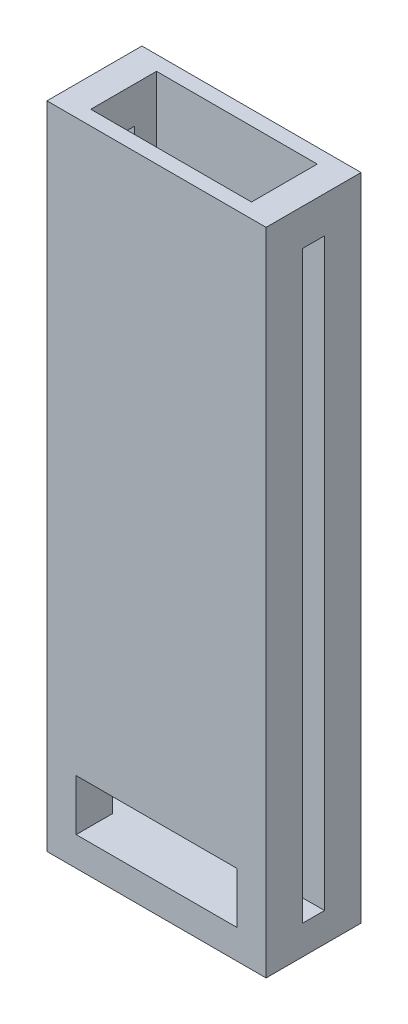
ISO-10303-21;
HEADER;
FILE_DESCRIPTION(('STEP AP214'),'2;1');
FILE_NAME('part.step','',(''),(''),'','','');
FILE_SCHEMA(('AUTOMOTIVE_DESIGN { 1 0 10303 214 1 1 1 1 }'));
ENDSEC;
DATA;
#1=APPLICATION_CONTEXT('core data for automotive mechanical design processes');
#2=APPLICATION_PROTOCOL_DEFINITION('international standard','automotive_design',2000,#1);
#3=PRODUCT_CONTEXT('',#1,'mechanical');
#4=PRODUCT('Part','Part','',(#3));
#5=PRODUCT_RELATED_PRODUCT_CATEGORY('part','',(#4));
#6=PRODUCT_DEFINITION_FORMATION('','',#4);
#7=PRODUCT_DEFINITION_CONTEXT('part definition',#1,'design');
#8=PRODUCT_DEFINITION('design','',#6,#7);
#9=PRODUCT_DEFINITION_SHAPE('','',#8);
#10=(LENGTH_UNIT() NAMED_UNIT(*) SI_UNIT(.MILLI.,.METRE.));
#11=(NAMED_UNIT(*) PLANE_ANGLE_UNIT() SI_UNIT($,.RADIAN.));
#12=(NAMED_UNIT(*) SI_UNIT($,.STERADIAN.) SOLID_ANGLE_UNIT());
#13=UNCERTAINTY_MEASURE_WITH_UNIT(LENGTH_MEASURE(1.E-05),#10,'distance_accuracy_value','');
#14=(GEOMETRIC_REPRESENTATION_CONTEXT(3) GLOBAL_UNCERTAINTY_ASSIGNED_CONTEXT((#13)) GLOBAL_UNIT_ASSIGNED_CONTEXT((#10,
#11,#12)) REPRESENTATION_CONTEXT('',''));
#15=CARTESIAN_POINT('',(0.,0.,0.));
#16=DIRECTION('',(0.,0.,1.));
#17=DIRECTION('',(1.,0.,0.));
#18=AXIS2_PLACEMENT_3D('',#15,#16,#17);
#19=CARTESIAN_POINT('',(0.,85.,13.));
#20=DIRECTION('',(0.,0.,-1.));
#21=DIRECTION('',(-1.,0.,0.));
#22=AXIS2_PLACEMENT_3D('',#19,#20,#21);
#23=PLANE('',#22);
#24=DIRECTION('',(0.,-1.,0.));
#25=VECTOR('',#24,1.);
#26=CARTESIAN_POINT('',(0.,85.,13.));
#27=LINE('',#26,#25);
#28=CARTESIAN_POINT('',(0.,85.,13.));
#29=VERTEX_POINT('',#28);
#30=CARTESIAN_POINT('',(0.,-4.,13.));
#31=VERTEX_POINT('',#30);
#32=EDGE_CURVE('E370',#29,#31,#27,.T.);
#33=ORIENTED_EDGE('',*,*,#32,.T.);
#34=DIRECTION('',(1.,0.,0.));
#35=VECTOR('',#34,1.);
#36=CARTESIAN_POINT('',(0.,-4.,13.));
#37=LINE('',#36,#35);
#38=CARTESIAN_POINT('',(30.,-4.,13.));
#39=VERTEX_POINT('',#38);
#40=EDGE_CURVE('E298',#31,#39,#37,.T.);
#41=ORIENTED_EDGE('',*,*,#40,.T.);
#42=DIRECTION('',(0.,-1.,0.));
#43=VECTOR('',#42,1.);
#44=CARTESIAN_POINT('',(30.,85.,13.));
#45=LINE('',#44,#43);
#46=CARTESIAN_POINT('',(30.,85.,13.));
#47=VERTEX_POINT('',#46);
#48=EDGE_CURVE('E367',#47,#39,#45,.T.);
#49=ORIENTED_EDGE('',*,*,#48,.F.);
#50=DIRECTION('',(1.,0.,0.));
#51=VECTOR('',#50,1.);
#52=CARTESIAN_POINT('',(0.,85.,13.));
#53=LINE('',#52,#51);
#54=EDGE_CURVE('E352',#29,#47,#53,.T.);
#55=ORIENTED_EDGE('',*,*,#54,.F.);
#56=EDGE_LOOP('',(#33,#41,#49,#55));
#57=FACE_BOUND('',#56,.T.);
#58=DIRECTION('',(0.,1.,0.));
#59=VECTOR('',#58,1.);
#60=CARTESIAN_POINT('',(4.,0.,13.));
#61=LINE('',#60,#59);
#62=CARTESIAN_POINT('',(4.,0.,13.));
#63=VERTEX_POINT('',#62);
#64=CARTESIAN_POINT('',(4.,7.,13.));
#65=VERTEX_POINT('',#64);
#66=EDGE_CURVE('E252',#63,#65,#61,.T.);
#67=ORIENTED_EDGE('',*,*,#66,.T.);
#68=DIRECTION('',(1.,0.,0.));
#69=VECTOR('',#68,1.);
#70=CARTESIAN_POINT('',(4.,7.,13.));
#71=LINE('',#70,#69);
#72=CARTESIAN_POINT('',(26.,7.,13.));
#73=VERTEX_POINT('',#72);
#74=EDGE_CURVE('E272',#65,#73,#71,.T.);
#75=ORIENTED_EDGE('',*,*,#74,.T.);
#76=DIRECTION('',(0.,1.,0.));
#77=VECTOR('',#76,1.);
#78=CARTESIAN_POINT('',(26.,0.,13.));
#79=LINE('',#78,#77);
#80=CARTESIAN_POINT('',(26.,0.,13.));
#81=VERTEX_POINT('',#80);
#82=EDGE_CURVE('E276',#81,#73,#79,.T.);
#83=ORIENTED_EDGE('',*,*,#82,.F.);
#84=DIRECTION('',(1.,0.,0.));
#85=VECTOR('',#84,1.);
#86=CARTESIAN_POINT('',(4.,0.,13.));
#87=LINE('',#86,#85);
#88=EDGE_CURVE('E257',#63,#81,#87,.T.);
#89=ORIENTED_EDGE('',*,*,#88,.F.);
#90=EDGE_LOOP('',(#67,#75,#83,#89));
#91=FACE_BOUND('',#90,.T.);
#92=ADVANCED_FACE('F38',(#57,#91),#23,.F.);
#93=CARTESIAN_POINT('',(0.,85.,0.));
#94=DIRECTION('',(0.,0.,1.));
#95=DIRECTION('',(1.,0.,0.));
#96=AXIS2_PLACEMENT_3D('',#93,#94,#95);
#97=PLANE('',#96);
#98=DIRECTION('',(0.,-1.,0.));
#99=VECTOR('',#98,1.);
#100=CARTESIAN_POINT('',(30.,85.,0.));
#101=LINE('',#100,#99);
#102=CARTESIAN_POINT('',(30.,85.,0.));
#103=VERTEX_POINT('',#102);
#104=CARTESIAN_POINT('',(30.,-4.,0.));
#105=VERTEX_POINT('',#104);
#106=EDGE_CURVE('E364',#103,#105,#101,.T.);
#107=ORIENTED_EDGE('',*,*,#106,.T.);
#108=DIRECTION('',(-1.,0.,0.));
#109=VECTOR('',#108,1.);
#110=CARTESIAN_POINT('',(0.,-4.,0.));
#111=LINE('',#110,#109);
#112=CARTESIAN_POINT('',(0.,-4.,0.));
#113=VERTEX_POINT('',#112);
#114=EDGE_CURVE('E306',#105,#113,#111,.T.);
#115=ORIENTED_EDGE('',*,*,#114,.T.);
#116=DIRECTION('',(0.,-1.,0.));
#117=VECTOR('',#116,1.);
#118=CARTESIAN_POINT('',(0.,85.,0.));
#119=LINE('',#118,#117);
#120=CARTESIAN_POINT('',(0.,85.,0.));
#121=VERTEX_POINT('',#120);
#122=EDGE_CURVE('E361',#121,#113,#119,.T.);
#123=ORIENTED_EDGE('',*,*,#122,.F.);
#124=DIRECTION('',(-1.,0.,0.));
#125=VECTOR('',#124,1.);
#126=CARTESIAN_POINT('',(0.,85.,0.));
#127=LINE('',#126,#125);
#128=EDGE_CURVE('E358',#103,#121,#127,.T.);
#129=ORIENTED_EDGE('',*,*,#128,.F.);
#130=EDGE_LOOP('',(#107,#115,#123,#129));
#131=FACE_BOUND('',#130,.T.);
#132=DIRECTION('',(0.,1.,0.));
#133=VECTOR('',#132,1.);
#134=CARTESIAN_POINT('',(4.,0.,0.));
#135=LINE('',#134,#133);
#136=CARTESIAN_POINT('',(4.,0.,0.));
#137=VERTEX_POINT('',#136);
#138=CARTESIAN_POINT('',(4.,7.,0.));
#139=VERTEX_POINT('',#138);
#140=EDGE_CURVE('E253',#137,#139,#135,.T.);
#141=ORIENTED_EDGE('',*,*,#140,.F.);
#142=DIRECTION('',(1.,0.,0.));
#143=VECTOR('',#142,1.);
#144=CARTESIAN_POINT('',(4.,0.,0.));
#145=LINE('',#144,#143);
#146=CARTESIAN_POINT('',(26.,0.,0.));
#147=VERTEX_POINT('',#146);
#148=EDGE_CURVE('E264',#137,#147,#145,.T.);
#149=ORIENTED_EDGE('',*,*,#148,.T.);
#150=DIRECTION('',(0.,1.,0.));
#151=VECTOR('',#150,1.);
#152=CARTESIAN_POINT('',(26.,0.,0.));
#153=LINE('',#152,#151);
#154=CARTESIAN_POINT('',(26.,7.,0.));
#155=VERTEX_POINT('',#154);
#156=EDGE_CURVE('E260',#147,#155,#153,.T.);
#157=ORIENTED_EDGE('',*,*,#156,.T.);
#158=DIRECTION('',(1.,0.,0.));
#159=VECTOR('',#158,1.);
#160=CARTESIAN_POINT('',(4.,7.,0.));
#161=LINE('',#160,#159);
#162=EDGE_CURVE('E256',#139,#155,#161,.T.);
#163=ORIENTED_EDGE('',*,*,#162,.F.);
#164=EDGE_LOOP('',(#141,#149,#157,#163));
#165=FACE_BOUND('',#164,.T.);
#166=ADVANCED_FACE('F431',(#131,#165),#97,.F.);
#167=CARTESIAN_POINT('',(4.,0.,11.));
#168=DIRECTION('',(0.,0.,1.));
#169=DIRECTION('',(1.,0.,0.));
#170=AXIS2_PLACEMENT_3D('',#167,#168,#169);
#171=PLANE('',#170);
#172=DIRECTION('',(1.,0.,0.));
#173=VECTOR('',#172,1.);
#174=CARTESIAN_POINT('',(4.,7.,11.));
#175=LINE('',#174,#173);
#176=CARTESIAN_POINT('',(4.,7.,11.));
#177=VERTEX_POINT('',#176);
#178=CARTESIAN_POINT('',(26.,7.,11.));
#179=VERTEX_POINT('',#178);
#180=EDGE_CURVE('E291',#177,#179,#175,.T.);
#181=ORIENTED_EDGE('',*,*,#180,.F.);
#182=DIRECTION('',(0.,1.,0.));
#183=VECTOR('',#182,1.);
#184=CARTESIAN_POINT('',(4.,0.,11.));
#185=LINE('',#184,#183);
#186=CARTESIAN_POINT('',(4.,85.,11.));
#187=VERTEX_POINT('',#186);
#188=EDGE_CURVE('E341',#177,#187,#185,.T.);
#189=ORIENTED_EDGE('',*,*,#188,.T.);
#190=DIRECTION('',(1.,0.,0.));
#191=VECTOR('',#190,1.);
#192=CARTESIAN_POINT('',(4.,85.,11.));
#193=LINE('',#192,#191);
#194=CARTESIAN_POINT('',(26.,85.,11.));
#195=VERTEX_POINT('',#194);
#196=EDGE_CURVE('E333',#187,#195,#193,.T.);
#197=ORIENTED_EDGE('',*,*,#196,.T.);
#198=DIRECTION('',(0.,1.,0.));
#199=VECTOR('',#198,1.);
#200=CARTESIAN_POINT('',(26.,0.,11.));
#201=LINE('',#200,#199);
#202=EDGE_CURVE('E337',#179,#195,#201,.T.);
#203=ORIENTED_EDGE('',*,*,#202,.F.);
#204=EDGE_LOOP('',(#181,#189,#197,#203));
#205=FACE_BOUND('',#204,.T.);
#206=ADVANCED_FACE('F399',(#205),#171,.F.);
#207=CARTESIAN_POINT('',(4.,0.,2.));
#208=DIRECTION('',(0.,0.,-1.));
#209=DIRECTION('',(-1.,0.,0.));
#210=AXIS2_PLACEMENT_3D('',#207,#208,#209);
#211=PLANE('',#210);
#212=DIRECTION('',(-1.,0.,0.));
#213=VECTOR('',#212,1.);
#214=CARTESIAN_POINT('',(4.,7.,2.));
#215=LINE('',#214,#213);
#216=CARTESIAN_POINT('',(26.,7.,2.));
#217=VERTEX_POINT('',#216);
#218=CARTESIAN_POINT('',(4.,7.,2.));
#219=VERTEX_POINT('',#218);
#220=EDGE_CURVE('E47',#217,#219,#215,.T.);
#221=ORIENTED_EDGE('',*,*,#220,.F.);
#222=DIRECTION('',(0.,1.,0.));
#223=VECTOR('',#222,1.);
#224=CARTESIAN_POINT('',(26.,0.,2.));
#225=LINE('',#224,#223);
#226=CARTESIAN_POINT('',(26.,85.,2.));
#227=VERTEX_POINT('',#226);
#228=EDGE_CURVE('E321',#217,#227,#225,.T.);
#229=ORIENTED_EDGE('',*,*,#228,.T.);
#230=DIRECTION('',(-1.,0.,0.));
#231=VECTOR('',#230,1.);
#232=CARTESIAN_POINT('',(4.,85.,2.));
#233=LINE('',#232,#231);
#234=CARTESIAN_POINT('',(4.,85.,2.));
#235=VERTEX_POINT('',#234);
#236=EDGE_CURVE('E325',#227,#235,#233,.T.);
#237=ORIENTED_EDGE('',*,*,#236,.T.);
#238=DIRECTION('',(0.,1.,0.));
#239=VECTOR('',#238,1.);
#240=CARTESIAN_POINT('',(4.,0.,2.));
#241=LINE('',#240,#239);
#242=EDGE_CURVE('E344',#219,#235,#241,.T.);
#243=ORIENTED_EDGE('',*,*,#242,.F.);
#244=EDGE_LOOP('',(#221,#229,#237,#243));
#245=FACE_BOUND('',#244,.T.);
#246=ADVANCED_FACE('F386',(#245),#211,.F.);
#247=CARTESIAN_POINT('',(0.,85.,0.));
#248=DIRECTION('',(1.,0.,0.));
#249=DIRECTION('',(0.,0.,-1.));
#250=AXIS2_PLACEMENT_3D('',#247,#248,#249);
#251=PLANE('',#250);
#252=DIRECTION('',(0.,0.,-1.));
#253=VECTOR('',#252,1.);
#254=CARTESIAN_POINT('',(0.,80.,5.));
#255=LINE('',#254,#253);
#256=CARTESIAN_POINT('',(0.,80.,8.));
#257=VERTEX_POINT('',#256);
#258=CARTESIAN_POINT('',(0.,80.,5.));
#259=VERTEX_POINT('',#258);
#260=EDGE_CURVE('E217',#257,#259,#255,.T.);
#261=ORIENTED_EDGE('',*,*,#260,.F.);
#262=DIRECTION('',(0.,1.,0.));
#263=VECTOR('',#262,1.);
#264=CARTESIAN_POINT('',(0.,0.,8.));
#265=LINE('',#264,#263);
#266=CARTESIAN_POINT('',(0.,0.,8.));
#267=VERTEX_POINT('',#266);
#268=EDGE_CURVE('E54',#267,#257,#265,.T.);
#269=ORIENTED_EDGE('',*,*,#268,.F.);
#270=DIRECTION('',(0.,0.,1.));
#271=VECTOR('',#270,1.);
#272=CARTESIAN_POINT('',(0.,0.,5.));
#273=LINE('',#272,#271);
#274=CARTESIAN_POINT('',(0.,0.,5.));
#275=VERTEX_POINT('',#274);
#276=EDGE_CURVE('E204',#275,#267,#273,.T.);
#277=ORIENTED_EDGE('',*,*,#276,.F.);
#278=DIRECTION('',(0.,-1.,0.));
#279=VECTOR('',#278,1.);
#280=CARTESIAN_POINT('',(0.,0.,5.));
#281=LINE('',#280,#279);
#282=EDGE_CURVE('E208',#259,#275,#281,.T.);
#283=ORIENTED_EDGE('',*,*,#282,.F.);
#284=EDGE_LOOP('',(#261,#269,#277,#283));
#285=FACE_BOUND('',#284,.T.);
#286=ORIENTED_EDGE('',*,*,#122,.T.);
#287=DIRECTION('',(0.,0.,1.));
#288=VECTOR('',#287,1.);
#289=CARTESIAN_POINT('',(0.,-4.,0.));
#290=LINE('',#289,#288);
#291=EDGE_CURVE('E294',#113,#31,#290,.T.);
#292=ORIENTED_EDGE('',*,*,#291,.T.);
#293=ORIENTED_EDGE('',*,*,#32,.F.);
#294=DIRECTION('',(0.,0.,1.));
#295=VECTOR('',#294,1.);
#296=CARTESIAN_POINT('',(0.,85.,0.));
#297=LINE('',#296,#295);
#298=EDGE_CURVE('E340',#121,#29,#297,.T.);
#299=ORIENTED_EDGE('',*,*,#298,.F.);
#300=EDGE_LOOP('',(#286,#292,#293,#299));
#301=FACE_BOUND('',#300,.T.);
#302=ADVANCED_FACE('F40',(#285,#301),#251,.F.);
#303=CARTESIAN_POINT('',(30.,85.,0.));
#304=DIRECTION('',(-1.,0.,0.));
#305=DIRECTION('',(0.,0.,1.));
#306=AXIS2_PLACEMENT_3D('',#303,#304,#305);
#307=PLANE('',#306);
#308=DIRECTION('',(0.,0.,1.));
#309=VECTOR('',#308,1.);
#310=CARTESIAN_POINT('',(30.,0.,5.));
#311=LINE('',#310,#309);
#312=CARTESIAN_POINT('',(30.,0.,5.));
#313=VERTEX_POINT('',#312);
#314=CARTESIAN_POINT('',(30.,0.,8.));
#315=VERTEX_POINT('',#314);
#316=EDGE_CURVE('E202',#313,#315,#311,.T.);
#317=ORIENTED_EDGE('',*,*,#316,.T.);
#318=DIRECTION('',(0.,1.,0.));
#319=VECTOR('',#318,1.);
#320=CARTESIAN_POINT('',(30.,0.,8.));
#321=LINE('',#320,#319);
#322=CARTESIAN_POINT('',(30.,80.,8.));
#323=VERTEX_POINT('',#322);
#324=EDGE_CURVE('E182',#315,#323,#321,.T.);
#325=ORIENTED_EDGE('',*,*,#324,.T.);
#326=DIRECTION('',(0.,0.,-1.));
#327=VECTOR('',#326,1.);
#328=CARTESIAN_POINT('',(30.,80.,5.));
#329=LINE('',#328,#327);
#330=CARTESIAN_POINT('',(30.,80.,5.));
#331=VERTEX_POINT('',#330);
#332=EDGE_CURVE('E193',#323,#331,#329,.T.);
#333=ORIENTED_EDGE('',*,*,#332,.T.);
#334=DIRECTION('',(0.,-1.,0.));
#335=VECTOR('',#334,1.);
#336=CARTESIAN_POINT('',(30.,0.,5.));
#337=LINE('',#336,#335);
#338=EDGE_CURVE('E62',#331,#313,#337,.T.);
#339=ORIENTED_EDGE('',*,*,#338,.T.);
#340=EDGE_LOOP('',(#317,#325,#333,#339));
#341=FACE_BOUND('',#340,.T.);
#342=ORIENTED_EDGE('',*,*,#48,.T.);
#343=DIRECTION('',(0.,0.,-1.));
#344=VECTOR('',#343,1.);
#345=CARTESIAN_POINT('',(30.,-4.,0.));
#346=LINE('',#345,#344);
#347=EDGE_CURVE('E302',#39,#105,#346,.T.);
#348=ORIENTED_EDGE('',*,*,#347,.T.);
#349=ORIENTED_EDGE('',*,*,#106,.F.);
#350=DIRECTION('',(0.,0.,-1.));
#351=VECTOR('',#350,1.);
#352=CARTESIAN_POINT('',(30.,85.,0.));
#353=LINE('',#352,#351);
#354=EDGE_CURVE('E355',#47,#103,#353,.T.);
#355=ORIENTED_EDGE('',*,*,#354,.F.);
#356=EDGE_LOOP('',(#342,#348,#349,#355));
#357=FACE_BOUND('',#356,.T.);
#358=ADVANCED_FACE('F199',(#341,#357),#307,.F.);
#359=CARTESIAN_POINT('',(0.,85.,0.));
#360=DIRECTION('',(0.,1.,0.));
#361=DIRECTION('',(0.,0.,1.));
#362=AXIS2_PLACEMENT_3D('',#359,#360,#361);
#363=PLANE('',#362);
#364=DIRECTION('',(0.,0.,-1.));
#365=VECTOR('',#364,1.);
#366=CARTESIAN_POINT('',(26.,85.,11.));
#367=LINE('',#366,#365);
#368=EDGE_CURVE('E310',#195,#227,#367,.T.);
#369=ORIENTED_EDGE('',*,*,#368,.F.);
#370=ORIENTED_EDGE('',*,*,#196,.F.);
#371=DIRECTION('',(0.,0.,1.));
#372=VECTOR('',#371,1.);
#373=CARTESIAN_POINT('',(4.,85.,11.));
#374=LINE('',#373,#372);
#375=EDGE_CURVE('E329',#235,#187,#374,.T.);
#376=ORIENTED_EDGE('',*,*,#375,.F.);
#377=ORIENTED_EDGE('',*,*,#236,.F.);
#378=EDGE_LOOP('',(#369,#370,#376,#377));
#379=FACE_BOUND('',#378,.T.);
#380=ORIENTED_EDGE('',*,*,#298,.T.);
#381=ORIENTED_EDGE('',*,*,#54,.T.);
#382=ORIENTED_EDGE('',*,*,#354,.T.);
#383=ORIENTED_EDGE('',*,*,#128,.T.);
#384=EDGE_LOOP('',(#380,#381,#382,#383));
#385=FACE_BOUND('',#384,.T.);
#386=ADVANCED_FACE('F392',(#379,#385),#363,.T.);
#387=CARTESIAN_POINT('',(26.,0.,11.));
#388=DIRECTION('',(1.,0.,0.));
#389=DIRECTION('',(0.,0.,-1.));
#390=AXIS2_PLACEMENT_3D('',#387,#388,#389);
#391=PLANE('',#390);
#392=DIRECTION('',(0.,0.,1.));
#393=VECTOR('',#392,1.);
#394=CARTESIAN_POINT('',(26.,80.,11.));
#395=LINE('',#394,#393);
#396=CARTESIAN_POINT('',(26.,80.,5.));
#397=VERTEX_POINT('',#396);
#398=CARTESIAN_POINT('',(26.,80.,8.));
#399=VERTEX_POINT('',#398);
#400=EDGE_CURVE('E249',#397,#399,#395,.T.);
#401=ORIENTED_EDGE('',*,*,#400,.T.);
#402=DIRECTION('',(0.,-1.,0.));
#403=VECTOR('',#402,1.);
#404=CARTESIAN_POINT('',(26.,0.,8.));
#405=LINE('',#404,#403);
#406=CARTESIAN_POINT('',(26.,0.,8.));
#407=VERTEX_POINT('',#406);
#408=EDGE_CURVE('E185',#399,#407,#405,.T.);
#409=ORIENTED_EDGE('',*,*,#408,.T.);
#410=DIRECTION('',(0.,0.,-1.));
#411=VECTOR('',#410,1.);
#412=CARTESIAN_POINT('',(26.,0.,11.));
#413=LINE('',#412,#411);
#414=EDGE_CURVE('E311',#81,#407,#413,.T.);
#415=ORIENTED_EDGE('',*,*,#414,.F.);
#416=ORIENTED_EDGE('',*,*,#82,.T.);
#417=DIRECTION('',(0.,0.,1.));
#418=VECTOR('',#417,1.);
#419=CARTESIAN_POINT('',(26.,7.,0.));
#420=LINE('',#419,#418);
#421=EDGE_CURVE('E268',#179,#73,#420,.T.);
#422=ORIENTED_EDGE('',*,*,#421,.F.);
#423=ORIENTED_EDGE('',*,*,#202,.T.);
#424=ORIENTED_EDGE('',*,*,#368,.T.);
#425=ORIENTED_EDGE('',*,*,#228,.F.);
#426=EDGE_CURVE('E283',#155,#217,#420,.T.);
#427=ORIENTED_EDGE('',*,*,#426,.F.);
#428=ORIENTED_EDGE('',*,*,#156,.F.);
#429=CARTESIAN_POINT('',(26.,0.,5.));
#430=VERTEX_POINT('',#429);
#431=EDGE_CURVE('E316',#430,#147,#413,.T.);
#432=ORIENTED_EDGE('',*,*,#431,.F.);
#433=DIRECTION('',(0.,1.,0.));
#434=VECTOR('',#433,1.);
#435=CARTESIAN_POINT('',(26.,0.,5.));
#436=LINE('',#435,#434);
#437=EDGE_CURVE('E239',#430,#397,#436,.T.);
#438=ORIENTED_EDGE('',*,*,#437,.T.);
#439=EDGE_LOOP('',(#401,#409,#415,#416,#422,#423,#424,#425,#427,#428,#432,#438));
#440=FACE_BOUND('',#439,.T.);
#441=ADVANCED_FACE('F405',(#440),#391,.F.);
#442=CARTESIAN_POINT('',(4.,0.,11.));
#443=DIRECTION('',(-1.,0.,0.));
#444=DIRECTION('',(0.,0.,1.));
#445=AXIS2_PLACEMENT_3D('',#442,#443,#444);
#446=PLANE('',#445);
#447=DIRECTION('',(0.,0.,1.));
#448=VECTOR('',#447,1.);
#449=CARTESIAN_POINT('',(4.,0.,11.));
#450=LINE('',#449,#448);
#451=CARTESIAN_POINT('',(4.00000000000001,0.,8.));
#452=VERTEX_POINT('',#451);
#453=EDGE_CURVE('E315',#452,#63,#450,.T.);
#454=ORIENTED_EDGE('',*,*,#453,.F.);
#455=DIRECTION('',(0.,1.,0.));
#456=VECTOR('',#455,1.);
#457=CARTESIAN_POINT('',(4.,0.,8.));
#458=LINE('',#457,#456);
#459=CARTESIAN_POINT('',(4.00000000000001,80.,8.));
#460=VERTEX_POINT('',#459);
#461=EDGE_CURVE('E243',#452,#460,#458,.T.);
#462=ORIENTED_EDGE('',*,*,#461,.T.);
#463=DIRECTION('',(0.,0.,-1.));
#464=VECTOR('',#463,1.);
#465=CARTESIAN_POINT('',(4.,80.,11.));
#466=LINE('',#465,#464);
#467=CARTESIAN_POINT('',(4.,80.,5.));
#468=VERTEX_POINT('',#467);
#469=EDGE_CURVE('E11',#460,#468,#466,.T.);
#470=ORIENTED_EDGE('',*,*,#469,.T.);
#471=DIRECTION('',(0.,-1.,0.));
#472=VECTOR('',#471,1.);
#473=CARTESIAN_POINT('',(4.,0.,5.));
#474=LINE('',#473,#472);
#475=CARTESIAN_POINT('',(4.00000000000001,0.,5.));
#476=VERTEX_POINT('',#475);
#477=EDGE_CURVE('E227',#468,#476,#474,.T.);
#478=ORIENTED_EDGE('',*,*,#477,.T.);
#479=EDGE_CURVE('E317',#137,#476,#450,.T.);
#480=ORIENTED_EDGE('',*,*,#479,.F.);
#481=ORIENTED_EDGE('',*,*,#140,.T.);
#482=DIRECTION('',(0.,0.,1.));
#483=VECTOR('',#482,1.);
#484=CARTESIAN_POINT('',(4.,7.,0.));
#485=LINE('',#484,#483);
#486=EDGE_CURVE('E287',#139,#219,#485,.T.);
#487=ORIENTED_EDGE('',*,*,#486,.T.);
#488=ORIENTED_EDGE('',*,*,#242,.T.);
#489=ORIENTED_EDGE('',*,*,#375,.T.);
#490=ORIENTED_EDGE('',*,*,#188,.F.);
#491=EDGE_CURVE('E286',#177,#65,#485,.T.);
#492=ORIENTED_EDGE('',*,*,#491,.T.);
#493=ORIENTED_EDGE('',*,*,#66,.F.);
#494=EDGE_LOOP('',(#454,#462,#470,#478,#480,#481,#487,#488,#489,#490,#492,#493));
#495=FACE_BOUND('',#494,.T.);
#496=ADVANCED_FACE('F384',(#495),#446,.F.);
#497=CARTESIAN_POINT('',(0.,0.,0.));
#498=DIRECTION('',(0.,1.,0.));
#499=DIRECTION('',(0.,0.,1.));
#500=AXIS2_PLACEMENT_3D('',#497,#498,#499);
#501=PLANE('',#500);
#502=ORIENTED_EDGE('',*,*,#479,.T.);
#503=DIRECTION('',(-1.,0.,0.));
#504=VECTOR('',#503,1.);
#505=CARTESIAN_POINT('',(30.,0.,5.));
#506=LINE('',#505,#504);
#507=EDGE_CURVE('E233',#476,#275,#506,.T.);
#508=ORIENTED_EDGE('',*,*,#507,.T.);
#509=ORIENTED_EDGE('',*,*,#276,.T.);
#510=DIRECTION('',(-1.,0.,0.));
#511=VECTOR('',#510,1.);
#512=CARTESIAN_POINT('',(30.,0.,8.));
#513=LINE('',#512,#511);
#514=EDGE_CURVE('E228',#452,#267,#513,.T.);
#515=ORIENTED_EDGE('',*,*,#514,.F.);
#516=ORIENTED_EDGE('',*,*,#453,.T.);
#517=ORIENTED_EDGE('',*,*,#88,.T.);
#518=ORIENTED_EDGE('',*,*,#414,.T.);
#519=EDGE_CURVE('E224',#315,#407,#513,.T.);
#520=ORIENTED_EDGE('',*,*,#519,.F.);
#521=ORIENTED_EDGE('',*,*,#316,.F.);
#522=EDGE_CURVE('E229',#313,#430,#506,.T.);
#523=ORIENTED_EDGE('',*,*,#522,.T.);
#524=ORIENTED_EDGE('',*,*,#431,.T.);
#525=ORIENTED_EDGE('',*,*,#148,.F.);
#526=EDGE_LOOP('',(#502,#508,#509,#515,#516,#517,#518,#520,#521,#523,#524,#525));
#527=FACE_BOUND('',#526,.T.);
#528=ADVANCED_FACE('F426',(#527),#501,.T.);
#529=CARTESIAN_POINT('',(0.,-4.,0.));
#530=DIRECTION('',(0.,1.,0.));
#531=DIRECTION('',(0.,0.,1.));
#532=AXIS2_PLACEMENT_3D('',#529,#530,#531);
#533=PLANE('',#532);
#534=ORIENTED_EDGE('',*,*,#291,.F.);
#535=ORIENTED_EDGE('',*,*,#114,.F.);
#536=ORIENTED_EDGE('',*,*,#347,.F.);
#537=ORIENTED_EDGE('',*,*,#40,.F.);
#538=EDGE_LOOP('',(#534,#535,#536,#537));
#539=FACE_BOUND('',#538,.T.);
#540=ADVANCED_FACE('F459',(#539),#533,.F.);
#541=CARTESIAN_POINT('',(4.,7.,0.));
#542=DIRECTION('',(0.,-1.,0.));
#543=DIRECTION('',(0.,0.,-1.));
#544=AXIS2_PLACEMENT_3D('',#541,#542,#543);
#545=PLANE('',#544);
#546=ORIENTED_EDGE('',*,*,#220,.T.);
#547=ORIENTED_EDGE('',*,*,#486,.F.);
#548=ORIENTED_EDGE('',*,*,#162,.T.);
#549=ORIENTED_EDGE('',*,*,#426,.T.);
#550=EDGE_LOOP('',(#546,#547,#548,#549));
#551=FACE_BOUND('',#550,.T.);
#552=ADVANCED_FACE('F376',(#551),#545,.T.);
#553=ORIENTED_EDGE('',*,*,#180,.T.);
#554=ORIENTED_EDGE('',*,*,#421,.T.);
#555=ORIENTED_EDGE('',*,*,#74,.F.);
#556=ORIENTED_EDGE('',*,*,#491,.F.);
#557=EDGE_LOOP('',(#553,#554,#555,#556));
#558=FACE_BOUND('',#557,.T.);
#559=ADVANCED_FACE('F403',(#558),#545,.T.);
#560=CARTESIAN_POINT('',(30.,80.,5.));
#561=DIRECTION('',(0.,1.,0.));
#562=DIRECTION('',(0.,0.,1.));
#563=AXIS2_PLACEMENT_3D('',#560,#561,#562);
#564=PLANE('',#563);
#565=DIRECTION('',(-1.,0.,0.));
#566=VECTOR('',#565,1.);
#567=CARTESIAN_POINT('',(30.,80.,8.));
#568=LINE('',#567,#566);
#569=EDGE_CURVE('E190',#460,#257,#568,.T.);
#570=ORIENTED_EDGE('',*,*,#569,.T.);
#571=ORIENTED_EDGE('',*,*,#260,.T.);
#572=DIRECTION('',(-1.,0.,0.));
#573=VECTOR('',#572,1.);
#574=CARTESIAN_POINT('',(30.,80.,5.));
#575=LINE('',#574,#573);
#576=EDGE_CURVE('E189',#468,#259,#575,.T.);
#577=ORIENTED_EDGE('',*,*,#576,.F.);
#578=ORIENTED_EDGE('',*,*,#469,.F.);
#579=EDGE_LOOP('',(#570,#571,#577,#578));
#580=FACE_BOUND('',#579,.T.);
#581=ADVANCED_FACE('F415',(#580),#564,.F.);
#582=CARTESIAN_POINT('',(30.,0.,5.));
#583=DIRECTION('',(0.,0.,-1.));
#584=DIRECTION('',(-1.,0.,0.));
#585=AXIS2_PLACEMENT_3D('',#582,#583,#584);
#586=PLANE('',#585);
#587=ORIENTED_EDGE('',*,*,#576,.T.);
#588=ORIENTED_EDGE('',*,*,#282,.T.);
#589=ORIENTED_EDGE('',*,*,#507,.F.);
#590=ORIENTED_EDGE('',*,*,#477,.F.);
#591=EDGE_LOOP('',(#587,#588,#589,#590));
#592=FACE_BOUND('',#591,.T.);
#593=ADVANCED_FACE('F421',(#592),#586,.F.);
#594=CARTESIAN_POINT('',(30.,0.,8.));
#595=DIRECTION('',(0.,0.,1.));
#596=DIRECTION('',(1.,0.,0.));
#597=AXIS2_PLACEMENT_3D('',#594,#595,#596);
#598=PLANE('',#597);
#599=ORIENTED_EDGE('',*,*,#514,.T.);
#600=ORIENTED_EDGE('',*,*,#268,.T.);
#601=ORIENTED_EDGE('',*,*,#569,.F.);
#602=ORIENTED_EDGE('',*,*,#461,.F.);
#603=EDGE_LOOP('',(#599,#600,#601,#602));
#604=FACE_BOUND('',#603,.T.);
#605=ADVANCED_FACE('F424',(#604),#598,.F.);
#606=EDGE_CURVE('E195',#331,#397,#575,.T.);
#607=ORIENTED_EDGE('',*,*,#606,.F.);
#608=ORIENTED_EDGE('',*,*,#332,.F.);
#609=EDGE_CURVE('E178',#323,#399,#568,.T.);
#610=ORIENTED_EDGE('',*,*,#609,.T.);
#611=ORIENTED_EDGE('',*,*,#400,.F.);
#612=EDGE_LOOP('',(#607,#608,#610,#611));
#613=FACE_BOUND('',#612,.T.);
#614=ADVANCED_FACE('F194',(#613),#564,.F.);
#615=ORIENTED_EDGE('',*,*,#609,.F.);
#616=ORIENTED_EDGE('',*,*,#324,.F.);
#617=ORIENTED_EDGE('',*,*,#519,.T.);
#618=ORIENTED_EDGE('',*,*,#408,.F.);
#619=EDGE_LOOP('',(#615,#616,#617,#618));
#620=FACE_BOUND('',#619,.T.);
#621=ADVANCED_FACE('F180',(#620),#598,.F.);
#622=ORIENTED_EDGE('',*,*,#522,.F.);
#623=ORIENTED_EDGE('',*,*,#338,.F.);
#624=ORIENTED_EDGE('',*,*,#606,.T.);
#625=ORIENTED_EDGE('',*,*,#437,.F.);
#626=EDGE_LOOP('',(#622,#623,#624,#625));
#627=FACE_BOUND('',#626,.T.);
#628=ADVANCED_FACE('F434',(#627),#586,.F.);
#629=CLOSED_SHELL('',(#92,#166,#206,#246,#302,#358,#386,#441,#496,#528,#540,#552,#559,#581,#593,
#605,#614,#621,#628));
#630=MANIFOLD_SOLID_BREP('B2',#629);
#631=ADVANCED_BREP_SHAPE_REPRESENTATION('',(#18,#630),#14);
#632=SHAPE_DEFINITION_REPRESENTATION(#9,#631);
ENDSEC;
END-ISO-10303-21;
